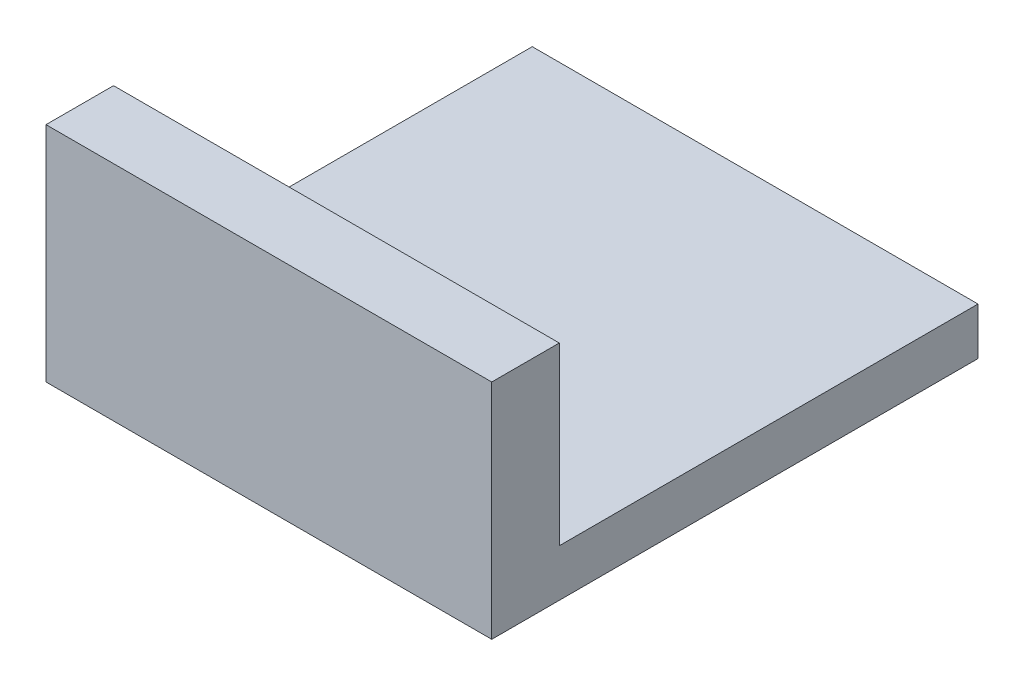
ISO-10303-21;
HEADER;
FILE_DESCRIPTION(('STEP AP214'),'2;1');
FILE_NAME('part.step','',(''),(''),'','','');
FILE_SCHEMA(('AUTOMOTIVE_DESIGN { 1 0 10303 214 1 1 1 1 }'));
ENDSEC;
DATA;
#1=APPLICATION_CONTEXT('core data for automotive mechanical design processes');
#2=APPLICATION_PROTOCOL_DEFINITION('international standard','automotive_design',2000,#1);
#3=PRODUCT_CONTEXT('',#1,'mechanical');
#4=PRODUCT('Part','Part','',(#3));
#5=PRODUCT_RELATED_PRODUCT_CATEGORY('part','',(#4));
#6=PRODUCT_DEFINITION_FORMATION('','',#4);
#7=PRODUCT_DEFINITION_CONTEXT('part definition',#1,'design');
#8=PRODUCT_DEFINITION('design','',#6,#7);
#9=PRODUCT_DEFINITION_SHAPE('','',#8);
#10=(LENGTH_UNIT() NAMED_UNIT(*) SI_UNIT(.MILLI.,.METRE.));
#11=(NAMED_UNIT(*) PLANE_ANGLE_UNIT() SI_UNIT($,.RADIAN.));
#12=(NAMED_UNIT(*) SI_UNIT($,.STERADIAN.) SOLID_ANGLE_UNIT());
#13=UNCERTAINTY_MEASURE_WITH_UNIT(LENGTH_MEASURE(1.E-05),#10,'distance_accuracy_value','');
#14=(GEOMETRIC_REPRESENTATION_CONTEXT(3) GLOBAL_UNCERTAINTY_ASSIGNED_CONTEXT((#13)) GLOBAL_UNIT_ASSIGNED_CONTEXT((#10,
#11,#12)) REPRESENTATION_CONTEXT('',''));
#15=CARTESIAN_POINT('',(0.,0.,0.));
#16=DIRECTION('',(0.,0.,1.));
#17=DIRECTION('',(1.,0.,0.));
#18=AXIS2_PLACEMENT_3D('',#15,#16,#17);
#19=CARTESIAN_POINT('',(0.,1.75,0.));
#20=DIRECTION('',(0.,-1.,0.));
#21=DIRECTION('',(0.,0.,-1.));
#22=AXIS2_PLACEMENT_3D('',#19,#20,#21);
#23=PLANE('',#22);
#24=DIRECTION('',(-1.,0.,0.));
#25=VECTOR('',#24,1.);
#26=CARTESIAN_POINT('',(-8.25,1.75,6.5));
#27=LINE('',#26,#25);
#28=CARTESIAN_POINT('',(8.25,1.75,6.5));
#29=VERTEX_POINT('',#28);
#30=CARTESIAN_POINT('',(-8.25,1.75,6.5));
#31=VERTEX_POINT('',#30);
#32=EDGE_CURVE('E161',#29,#31,#27,.T.);
#33=ORIENTED_EDGE('',*,*,#32,.F.);
#34=DIRECTION('',(0.,0.,-1.));
#35=VECTOR('',#34,1.);
#36=CARTESIAN_POINT('',(8.25,1.75,9.));
#37=LINE('',#36,#35);
#38=CARTESIAN_POINT('',(8.25,1.75,-9.));
#39=VERTEX_POINT('',#38);
#40=EDGE_CURVE('E193',#29,#39,#37,.T.);
#41=ORIENTED_EDGE('',*,*,#40,.T.);
#42=DIRECTION('',(-1.,0.,0.));
#43=VECTOR('',#42,1.);
#44=CARTESIAN_POINT('',(-8.25,1.75,-9.));
#45=LINE('',#44,#43);
#46=CARTESIAN_POINT('',(-8.25,1.75,-9.));
#47=VERTEX_POINT('',#46);
#48=EDGE_CURVE('E196',#39,#47,#45,.T.);
#49=ORIENTED_EDGE('',*,*,#48,.T.);
#50=DIRECTION('',(0.,0.,1.));
#51=VECTOR('',#50,1.);
#52=CARTESIAN_POINT('',(-8.25,1.75,9.));
#53=LINE('',#52,#51);
#54=EDGE_CURVE('E200',#47,#31,#53,.T.);
#55=ORIENTED_EDGE('',*,*,#54,.T.);
#56=EDGE_LOOP('',(#33,#41,#49,#55));
#57=FACE_BOUND('',#56,.T.);
#58=ADVANCED_FACE('F39',(#57),#23,.F.);
#59=CARTESIAN_POINT('',(8.25,1.75,9.));
#60=DIRECTION('',(-1.,0.,0.));
#61=DIRECTION('',(0.,0.,1.));
#62=AXIS2_PLACEMENT_3D('',#59,#60,#61);
#63=PLANE('',#62);
#64=DIRECTION('',(0.,0.,-1.));
#65=VECTOR('',#64,1.);
#66=CARTESIAN_POINT('',(8.25,0.,9.));
#67=LINE('',#66,#65);
#68=CARTESIAN_POINT('',(8.25,0.,9.));
#69=VERTEX_POINT('',#68);
#70=CARTESIAN_POINT('',(8.25,0.,-9.));
#71=VERTEX_POINT('',#70);
#72=EDGE_CURVE('E192',#69,#71,#67,.T.);
#73=ORIENTED_EDGE('',*,*,#72,.T.);
#74=DIRECTION('',(0.,-1.,0.));
#75=VECTOR('',#74,1.);
#76=CARTESIAN_POINT('',(8.25,1.75,-9.));
#77=LINE('',#76,#75);
#78=EDGE_CURVE('E11',#39,#71,#77,.T.);
#79=ORIENTED_EDGE('',*,*,#78,.F.);
#80=ORIENTED_EDGE('',*,*,#40,.F.);
#81=DIRECTION('',(0.,-1.,0.));
#82=VECTOR('',#81,1.);
#83=CARTESIAN_POINT('',(8.25,8.25,6.5));
#84=LINE('',#83,#82);
#85=CARTESIAN_POINT('',(8.25,8.25,6.5));
#86=VERTEX_POINT('',#85);
#87=EDGE_CURVE('E188',#86,#29,#84,.T.);
#88=ORIENTED_EDGE('',*,*,#87,.F.);
#89=DIRECTION('',(0.,0.,-1.));
#90=VECTOR('',#89,1.);
#91=CARTESIAN_POINT('',(8.25,8.25,9.));
#92=LINE('',#91,#90);
#93=CARTESIAN_POINT('',(8.25,8.25,9.));
#94=VERTEX_POINT('',#93);
#95=EDGE_CURVE('E175',#94,#86,#92,.T.);
#96=ORIENTED_EDGE('',*,*,#95,.F.);
#97=DIRECTION('',(0.,-1.,0.));
#98=VECTOR('',#97,1.);
#99=CARTESIAN_POINT('',(8.25,1.75,9.));
#100=LINE('',#99,#98);
#101=EDGE_CURVE('E203',#94,#69,#100,.T.);
#102=ORIENTED_EDGE('',*,*,#101,.T.);
#103=EDGE_LOOP('',(#73,#79,#80,#88,#96,#102));
#104=FACE_BOUND('',#103,.T.);
#105=ADVANCED_FACE('F41',(#104),#63,.F.);
#106=CARTESIAN_POINT('',(-8.25,1.75,-9.));
#107=DIRECTION('',(0.,0.,1.));
#108=DIRECTION('',(1.,0.,0.));
#109=AXIS2_PLACEMENT_3D('',#106,#107,#108);
#110=PLANE('',#109);
#111=DIRECTION('',(-1.,0.,0.));
#112=VECTOR('',#111,1.);
#113=CARTESIAN_POINT('',(-8.25,0.,-9.));
#114=LINE('',#113,#112);
#115=CARTESIAN_POINT('',(-8.25,0.,-9.));
#116=VERTEX_POINT('',#115);
#117=EDGE_CURVE('E207',#71,#116,#114,.T.);
#118=ORIENTED_EDGE('',*,*,#117,.T.);
#119=DIRECTION('',(0.,-1.,0.));
#120=VECTOR('',#119,1.);
#121=CARTESIAN_POINT('',(-8.25,1.75,-9.));
#122=LINE('',#121,#120);
#123=EDGE_CURVE('E48',#47,#116,#122,.T.);
#124=ORIENTED_EDGE('',*,*,#123,.F.);
#125=ORIENTED_EDGE('',*,*,#48,.F.);
#126=ORIENTED_EDGE('',*,*,#78,.T.);
#127=EDGE_LOOP('',(#118,#124,#125,#126));
#128=FACE_BOUND('',#127,.T.);
#129=ADVANCED_FACE('F250',(#128),#110,.F.);
#130=CARTESIAN_POINT('',(-8.25,1.75,9.));
#131=DIRECTION('',(1.,0.,0.));
#132=DIRECTION('',(0.,0.,-1.));
#133=AXIS2_PLACEMENT_3D('',#130,#131,#132);
#134=PLANE('',#133);
#135=DIRECTION('',(0.,0.,1.));
#136=VECTOR('',#135,1.);
#137=CARTESIAN_POINT('',(-8.25,0.,9.));
#138=LINE('',#137,#136);
#139=CARTESIAN_POINT('',(-8.25,0.,9.));
#140=VERTEX_POINT('',#139);
#141=EDGE_CURVE('E210',#116,#140,#138,.T.);
#142=ORIENTED_EDGE('',*,*,#141,.T.);
#143=DIRECTION('',(0.,-1.,0.));
#144=VECTOR('',#143,1.);
#145=CARTESIAN_POINT('',(-8.25,1.75,9.));
#146=LINE('',#145,#144);
#147=CARTESIAN_POINT('',(-8.25,8.25,9.));
#148=VERTEX_POINT('',#147);
#149=EDGE_CURVE('E218',#148,#140,#146,.T.);
#150=ORIENTED_EDGE('',*,*,#149,.F.);
#151=DIRECTION('',(0.,0.,1.));
#152=VECTOR('',#151,1.);
#153=CARTESIAN_POINT('',(-8.25,8.25,9.));
#154=LINE('',#153,#152);
#155=CARTESIAN_POINT('',(-8.25,8.25,6.5));
#156=VERTEX_POINT('',#155);
#157=EDGE_CURVE('E167',#156,#148,#154,.T.);
#158=ORIENTED_EDGE('',*,*,#157,.F.);
#159=DIRECTION('',(0.,-1.,0.));
#160=VECTOR('',#159,1.);
#161=CARTESIAN_POINT('',(-8.25,8.25,6.5));
#162=LINE('',#161,#160);
#163=EDGE_CURVE('E181',#156,#31,#162,.T.);
#164=ORIENTED_EDGE('',*,*,#163,.T.);
#165=ORIENTED_EDGE('',*,*,#54,.F.);
#166=ORIENTED_EDGE('',*,*,#123,.T.);
#167=EDGE_LOOP('',(#142,#150,#158,#164,#165,#166));
#168=FACE_BOUND('',#167,.T.);
#169=ADVANCED_FACE('F227',(#168),#134,.F.);
#170=CARTESIAN_POINT('',(-8.25,1.75,9.));
#171=DIRECTION('',(0.,0.,-1.));
#172=DIRECTION('',(-1.,0.,0.));
#173=AXIS2_PLACEMENT_3D('',#170,#171,#172);
#174=PLANE('',#173);
#175=DIRECTION('',(1.,0.,0.));
#176=VECTOR('',#175,1.);
#177=CARTESIAN_POINT('',(-8.25,0.,9.));
#178=LINE('',#177,#176);
#179=EDGE_CURVE('E197',#140,#69,#178,.T.);
#180=ORIENTED_EDGE('',*,*,#179,.T.);
#181=ORIENTED_EDGE('',*,*,#101,.F.);
#182=DIRECTION('',(1.,0.,0.));
#183=VECTOR('',#182,1.);
#184=CARTESIAN_POINT('',(-8.25,8.25,9.));
#185=LINE('',#184,#183);
#186=EDGE_CURVE('E171',#148,#94,#185,.T.);
#187=ORIENTED_EDGE('',*,*,#186,.F.);
#188=ORIENTED_EDGE('',*,*,#149,.T.);
#189=EDGE_LOOP('',(#180,#181,#187,#188));
#190=FACE_BOUND('',#189,.T.);
#191=ADVANCED_FACE('F235',(#190),#174,.F.);
#192=CARTESIAN_POINT('',(0.,0.,0.));
#193=DIRECTION('',(0.,-1.,0.));
#194=DIRECTION('',(0.,0.,-1.));
#195=AXIS2_PLACEMENT_3D('',#192,#193,#194);
#196=PLANE('',#195);
#197=DIRECTION('',(0.,0.,-1.));
#198=VECTOR('',#197,1.);
#199=CARTESIAN_POINT('',(2.,0.,3.));
#200=LINE('',#199,#198);
#201=CARTESIAN_POINT('',(2.,0.,3.));
#202=VERTEX_POINT('',#201);
#203=CARTESIAN_POINT('',(2.,0.,-1.));
#204=VERTEX_POINT('',#203);
#205=EDGE_CURVE('E152',#202,#204,#200,.T.);
#206=ORIENTED_EDGE('',*,*,#205,.T.);
#207=DIRECTION('',(-1.,0.,0.));
#208=VECTOR('',#207,1.);
#209=CARTESIAN_POINT('',(-2.,0.,-1.));
#210=LINE('',#209,#208);
#211=CARTESIAN_POINT('',(-2.,0.,-1.));
#212=VERTEX_POINT('',#211);
#213=EDGE_CURVE('E122',#204,#212,#210,.T.);
#214=ORIENTED_EDGE('',*,*,#213,.T.);
#215=DIRECTION('',(0.,0.,1.));
#216=VECTOR('',#215,1.);
#217=CARTESIAN_POINT('',(-2.,0.,3.));
#218=LINE('',#217,#216);
#219=CARTESIAN_POINT('',(-2.,0.,3.));
#220=VERTEX_POINT('',#219);
#221=EDGE_CURVE('E60',#212,#220,#218,.T.);
#222=ORIENTED_EDGE('',*,*,#221,.T.);
#223=DIRECTION('',(1.,0.,0.));
#224=VECTOR('',#223,1.);
#225=CARTESIAN_POINT('',(-2.,0.,3.));
#226=LINE('',#225,#224);
#227=EDGE_CURVE('E55',#220,#202,#226,.T.);
#228=ORIENTED_EDGE('',*,*,#227,.T.);
#229=EDGE_LOOP('',(#206,#214,#222,#228));
#230=FACE_BOUND('',#229,.T.);
#231=ORIENTED_EDGE('',*,*,#72,.F.);
#232=ORIENTED_EDGE('',*,*,#179,.F.);
#233=ORIENTED_EDGE('',*,*,#141,.F.);
#234=ORIENTED_EDGE('',*,*,#117,.F.);
#235=EDGE_LOOP('',(#231,#232,#233,#234));
#236=FACE_BOUND('',#235,.T.);
#237=ADVANCED_FACE('F233',(#230,#236),#196,.T.);
#238=CARTESIAN_POINT('',(-8.25,8.25,6.5));
#239=DIRECTION('',(0.,0.,1.));
#240=DIRECTION('',(1.,0.,0.));
#241=AXIS2_PLACEMENT_3D('',#238,#239,#240);
#242=PLANE('',#241);
#243=ORIENTED_EDGE('',*,*,#32,.T.);
#244=ORIENTED_EDGE('',*,*,#163,.F.);
#245=DIRECTION('',(-1.,0.,0.));
#246=VECTOR('',#245,1.);
#247=CARTESIAN_POINT('',(-8.25,8.25,6.5));
#248=LINE('',#247,#246);
#249=EDGE_CURVE('E178',#86,#156,#248,.T.);
#250=ORIENTED_EDGE('',*,*,#249,.F.);
#251=ORIENTED_EDGE('',*,*,#87,.T.);
#252=EDGE_LOOP('',(#243,#244,#250,#251));
#253=FACE_BOUND('',#252,.T.);
#254=ADVANCED_FACE('F248',(#253),#242,.F.);
#255=CARTESIAN_POINT('',(0.,8.25,0.));
#256=DIRECTION('',(0.,-1.,0.));
#257=DIRECTION('',(0.,0.,-1.));
#258=AXIS2_PLACEMENT_3D('',#255,#256,#257);
#259=PLANE('',#258);
#260=ORIENTED_EDGE('',*,*,#157,.T.);
#261=ORIENTED_EDGE('',*,*,#186,.T.);
#262=ORIENTED_EDGE('',*,*,#95,.T.);
#263=ORIENTED_EDGE('',*,*,#249,.T.);
#264=EDGE_LOOP('',(#260,#261,#262,#263));
#265=FACE_BOUND('',#264,.T.);
#266=ADVANCED_FACE('F244',(#265),#259,.F.);
#267=CARTESIAN_POINT('',(2.,-2.,3.));
#268=DIRECTION('',(1.,0.,0.));
#269=DIRECTION('',(0.,0.,-1.));
#270=AXIS2_PLACEMENT_3D('',#267,#268,#269);
#271=PLANE('',#270);
#272=ORIENTED_EDGE('',*,*,#205,.F.);
#273=DIRECTION('',(0.,1.,0.));
#274=VECTOR('',#273,1.);
#275=CARTESIAN_POINT('',(2.,-2.,3.));
#276=LINE('',#275,#274);
#277=CARTESIAN_POINT('',(2.,-2.,3.));
#278=VERTEX_POINT('',#277);
#279=EDGE_CURVE('E142',#278,#202,#276,.T.);
#280=ORIENTED_EDGE('',*,*,#279,.F.);
#281=DIRECTION('',(0.,0.,-1.));
#282=VECTOR('',#281,1.);
#283=CARTESIAN_POINT('',(2.,-2.,3.));
#284=LINE('',#283,#282);
#285=CARTESIAN_POINT('',(2.,-2.,-1.));
#286=VERTEX_POINT('',#285);
#287=EDGE_CURVE('E135',#278,#286,#284,.T.);
#288=ORIENTED_EDGE('',*,*,#287,.T.);
#289=DIRECTION('',(0.,1.,0.));
#290=VECTOR('',#289,1.);
#291=CARTESIAN_POINT('',(2.,-2.,-1.));
#292=LINE('',#291,#290);
#293=EDGE_CURVE('E117',#286,#204,#292,.T.);
#294=ORIENTED_EDGE('',*,*,#293,.T.);
#295=EDGE_LOOP('',(#272,#280,#288,#294));
#296=FACE_BOUND('',#295,.T.);
#297=ADVANCED_FACE('F141',(#296),#271,.T.);
#298=CARTESIAN_POINT('',(-2.,-2.,3.));
#299=DIRECTION('',(0.,0.,1.));
#300=DIRECTION('',(1.,0.,0.));
#301=AXIS2_PLACEMENT_3D('',#298,#299,#300);
#302=PLANE('',#301);
#303=ORIENTED_EDGE('',*,*,#227,.F.);
#304=DIRECTION('',(0.,1.,0.));
#305=VECTOR('',#304,1.);
#306=CARTESIAN_POINT('',(-2.,-2.,3.));
#307=LINE('',#306,#305);
#308=CARTESIAN_POINT('',(-2.,-2.,3.));
#309=VERTEX_POINT('',#308);
#310=EDGE_CURVE('E162',#309,#220,#307,.T.);
#311=ORIENTED_EDGE('',*,*,#310,.F.);
#312=DIRECTION('',(1.,0.,0.));
#313=VECTOR('',#312,1.);
#314=CARTESIAN_POINT('',(-2.,-2.,3.));
#315=LINE('',#314,#313);
#316=EDGE_CURVE('E128',#309,#278,#315,.T.);
#317=ORIENTED_EDGE('',*,*,#316,.T.);
#318=ORIENTED_EDGE('',*,*,#279,.T.);
#319=EDGE_LOOP('',(#303,#311,#317,#318));
#320=FACE_BOUND('',#319,.T.);
#321=ADVANCED_FACE('F291',(#320),#302,.T.);
#322=CARTESIAN_POINT('',(-2.,-2.,3.));
#323=DIRECTION('',(-1.,0.,0.));
#324=DIRECTION('',(0.,0.,1.));
#325=AXIS2_PLACEMENT_3D('',#322,#323,#324);
#326=PLANE('',#325);
#327=ORIENTED_EDGE('',*,*,#221,.F.);
#328=DIRECTION('',(0.,1.,0.));
#329=VECTOR('',#328,1.);
#330=CARTESIAN_POINT('',(-2.,-2.,-1.));
#331=LINE('',#330,#329);
#332=CARTESIAN_POINT('',(-2.,-2.,-1.));
#333=VERTEX_POINT('',#332);
#334=EDGE_CURVE('E127',#333,#212,#331,.T.);
#335=ORIENTED_EDGE('',*,*,#334,.F.);
#336=DIRECTION('',(0.,0.,1.));
#337=VECTOR('',#336,1.);
#338=CARTESIAN_POINT('',(-2.,-2.,3.));
#339=LINE('',#338,#337);
#340=EDGE_CURVE('E138',#333,#309,#339,.T.);
#341=ORIENTED_EDGE('',*,*,#340,.T.);
#342=ORIENTED_EDGE('',*,*,#310,.T.);
#343=EDGE_LOOP('',(#327,#335,#341,#342));
#344=FACE_BOUND('',#343,.T.);
#345=ADVANCED_FACE('F298',(#344),#326,.T.);
#346=CARTESIAN_POINT('',(-2.,-2.,-1.));
#347=DIRECTION('',(0.,0.,-1.));
#348=DIRECTION('',(-1.,0.,0.));
#349=AXIS2_PLACEMENT_3D('',#346,#347,#348);
#350=PLANE('',#349);
#351=ORIENTED_EDGE('',*,*,#213,.F.);
#352=ORIENTED_EDGE('',*,*,#293,.F.);
#353=DIRECTION('',(-1.,0.,0.));
#354=VECTOR('',#353,1.);
#355=CARTESIAN_POINT('',(-2.,-2.,-1.));
#356=LINE('',#355,#354);
#357=EDGE_CURVE('E121',#286,#333,#356,.T.);
#358=ORIENTED_EDGE('',*,*,#357,.T.);
#359=ORIENTED_EDGE('',*,*,#334,.T.);
#360=EDGE_LOOP('',(#351,#352,#358,#359));
#361=FACE_BOUND('',#360,.T.);
#362=ADVANCED_FACE('F119',(#361),#350,.T.);
#363=CARTESIAN_POINT('',(0.,-2.,0.));
#364=DIRECTION('',(0.,-1.,0.));
#365=DIRECTION('',(0.,0.,-1.));
#366=AXIS2_PLACEMENT_3D('',#363,#364,#365);
#367=PLANE('',#366);
#368=ORIENTED_EDGE('',*,*,#287,.F.);
#369=ORIENTED_EDGE('',*,*,#316,.F.);
#370=ORIENTED_EDGE('',*,*,#340,.F.);
#371=ORIENTED_EDGE('',*,*,#357,.F.);
#372=EDGE_LOOP('',(#368,#369,#370,#371));
#373=FACE_BOUND('',#372,.T.);
#374=ADVANCED_FACE('F133',(#373),#367,.T.);
#375=CLOSED_SHELL('',(#58,#105,#129,#169,#191,#237,#254,#266,#297,#321,#345,#362,#374));
#376=MANIFOLD_SOLID_BREP('B2',#375);
#377=ADVANCED_BREP_SHAPE_REPRESENTATION('',(#18,#376),#14);
#378=SHAPE_DEFINITION_REPRESENTATION(#9,#377);
ENDSEC;
END-ISO-10303-21;
